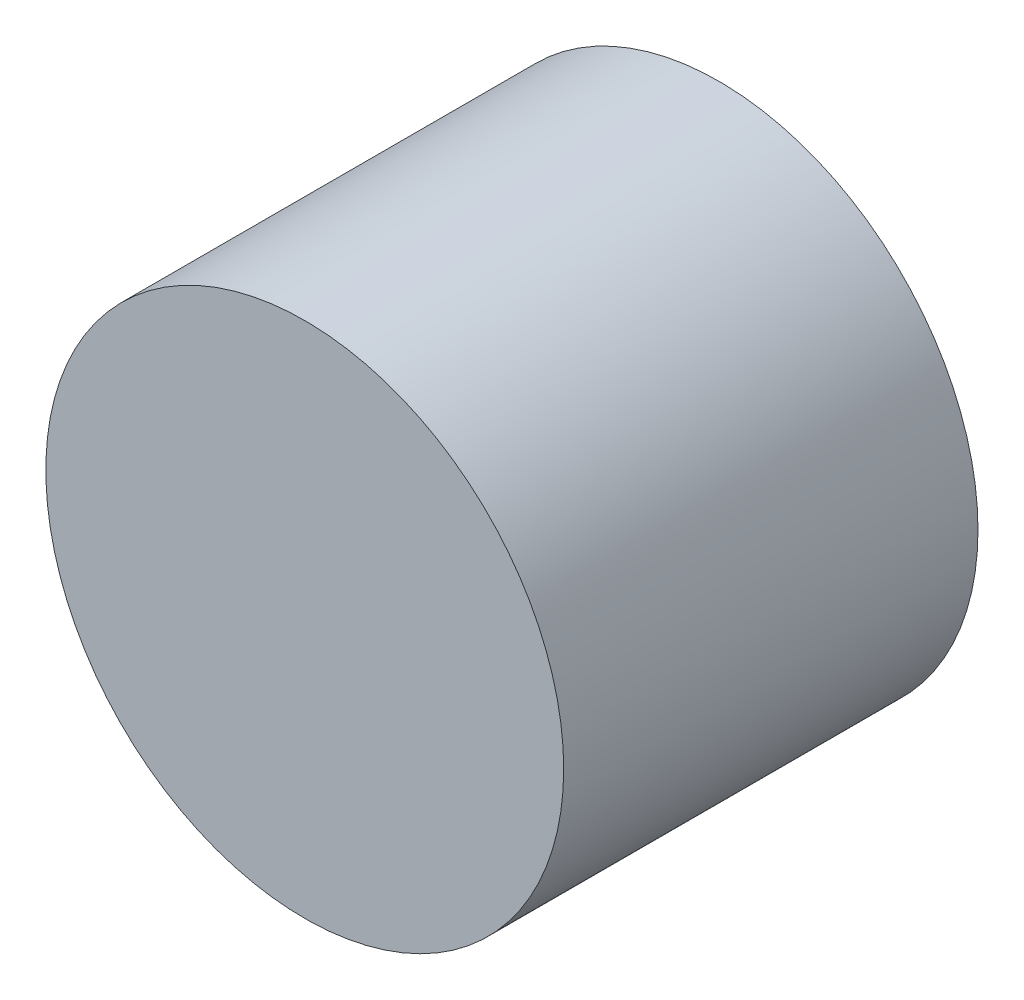
ISO-10303-21;
HEADER;
FILE_DESCRIPTION(('STEP AP214'),'2;1');
FILE_NAME('part.step','',(''),(''),'','','');
FILE_SCHEMA(('AUTOMOTIVE_DESIGN { 1 0 10303 214 1 1 1 1 }'));
ENDSEC;
DATA;
#1=APPLICATION_CONTEXT('core data for automotive mechanical design processes');
#2=APPLICATION_PROTOCOL_DEFINITION('international standard','automotive_design',2000,#1);
#3=PRODUCT_CONTEXT('',#1,'mechanical');
#4=PRODUCT('Part','Part','',(#3));
#5=PRODUCT_RELATED_PRODUCT_CATEGORY('part','',(#4));
#6=PRODUCT_DEFINITION_FORMATION('','',#4);
#7=PRODUCT_DEFINITION_CONTEXT('part definition',#1,'design');
#8=PRODUCT_DEFINITION('design','',#6,#7);
#9=PRODUCT_DEFINITION_SHAPE('','',#8);
#10=(LENGTH_UNIT() NAMED_UNIT(*) SI_UNIT(.MILLI.,.METRE.));
#11=(NAMED_UNIT(*) PLANE_ANGLE_UNIT() SI_UNIT($,.RADIAN.));
#12=(NAMED_UNIT(*) SI_UNIT($,.STERADIAN.) SOLID_ANGLE_UNIT());
#13=UNCERTAINTY_MEASURE_WITH_UNIT(LENGTH_MEASURE(1.E-05),#10,'distance_accuracy_value','');
#14=(GEOMETRIC_REPRESENTATION_CONTEXT(3) GLOBAL_UNCERTAINTY_ASSIGNED_CONTEXT((#13)) GLOBAL_UNIT_ASSIGNED_CONTEXT((#10,
#11,#12)) REPRESENTATION_CONTEXT('',''));
#15=CARTESIAN_POINT('',(0.,0.,0.));
#16=DIRECTION('',(0.,0.,1.));
#17=DIRECTION('',(1.,0.,0.));
#18=AXIS2_PLACEMENT_3D('',#15,#16,#17);
#19=CARTESIAN_POINT('',(0.,0.,1.));
#20=DIRECTION('',(0.,0.,-1.));
#21=DIRECTION('',(-1.,0.,0.));
#22=AXIS2_PLACEMENT_3D('',#19,#20,#21);
#23=CYLINDRICAL_SURFACE('',#22,1.5);
#24=CARTESIAN_POINT('',(0.,0.,0.9));
#25=DIRECTION('',(0.,0.,1.));
#26=DIRECTION('',(1.,0.,0.));
#27=AXIS2_PLACEMENT_3D('',#24,#25,#26);
#28=CIRCLE('',#27,1.5);
#29=CARTESIAN_POINT('',(1.5,0.,0.9));
#30=VERTEX_POINT('',#29);
#31=EDGE_CURVE('E44',#30,#30,#28,.T.);
#32=ORIENTED_EDGE('',*,*,#31,.T.);
#33=EDGE_LOOP('',(#32));
#34=FACE_BOUND('',#33,.T.);
#35=CARTESIAN_POINT('',(0.,0.,1.));
#36=DIRECTION('',(0.,0.,1.));
#37=DIRECTION('',(1.,0.,0.));
#38=AXIS2_PLACEMENT_3D('',#35,#36,#37);
#39=CIRCLE('',#38,1.5);
#40=CARTESIAN_POINT('',(1.5,0.,1.));
#41=VERTEX_POINT('',#40);
#42=EDGE_CURVE('E48',#41,#41,#39,.T.);
#43=ORIENTED_EDGE('',*,*,#42,.F.);
#44=EDGE_LOOP('',(#43));
#45=FACE_BOUND('',#44,.T.);
#46=ADVANCED_FACE('F37',(#34,#45),#23,.T.);
#47=CARTESIAN_POINT('',(0.,0.,0.));
#48=DIRECTION('',(0.,0.,1.));
#49=DIRECTION('',(1.,0.,0.));
#50=AXIS2_PLACEMENT_3D('',#47,#48,#49);
#51=PLANE('',#50);
#52=CARTESIAN_POINT('',(0.,0.,0.));
#53=DIRECTION('',(0.,0.,1.));
#54=DIRECTION('',(1.,0.,0.));
#55=AXIS2_PLACEMENT_3D('',#52,#53,#54);
#56=CIRCLE('',#55,0.6);
#57=CARTESIAN_POINT('',(0.6,0.,0.));
#58=VERTEX_POINT('',#57);
#59=EDGE_CURVE('E10',#58,#58,#56,.F.);
#60=ORIENTED_EDGE('',*,*,#59,.T.);
#61=EDGE_LOOP('',(#60));
#62=FACE_BOUND('',#61,.T.);
#63=ADVANCED_FACE('F66',(#62),#51,.F.);
#64=CARTESIAN_POINT('',(0.,0.,5.));
#65=DIRECTION('',(0.,0.,-1.));
#66=DIRECTION('',(-1.,0.,0.));
#67=AXIS2_PLACEMENT_3D('',#64,#65,#66);
#68=CYLINDRICAL_SURFACE('',#67,2.5);
#69=CARTESIAN_POINT('',(0.,0.,5.));
#70=DIRECTION('',(0.,0.,1.));
#71=DIRECTION('',(1.,0.,0.));
#72=AXIS2_PLACEMENT_3D('',#69,#70,#71);
#73=CIRCLE('',#72,2.5);
#74=CARTESIAN_POINT('',(2.5,0.,5.));
#75=VERTEX_POINT('',#74);
#76=EDGE_CURVE('E52',#75,#75,#73,.T.);
#77=ORIENTED_EDGE('',*,*,#76,.F.);
#78=EDGE_LOOP('',(#77));
#79=FACE_BOUND('',#78,.T.);
#80=CARTESIAN_POINT('',(0.,0.,1.));
#81=DIRECTION('',(0.,0.,1.));
#82=DIRECTION('',(1.,0.,0.));
#83=AXIS2_PLACEMENT_3D('',#80,#81,#82);
#84=CIRCLE('',#83,2.5);
#85=CARTESIAN_POINT('',(2.5,0.,1.));
#86=VERTEX_POINT('',#85);
#87=EDGE_CURVE('E55',#86,#86,#84,.T.);
#88=ORIENTED_EDGE('',*,*,#87,.T.);
#89=EDGE_LOOP('',(#88));
#90=FACE_BOUND('',#89,.T.);
#91=ADVANCED_FACE('F63',(#79,#90),#68,.T.);
#92=CARTESIAN_POINT('',(0.,0.,5.));
#93=DIRECTION('',(0.,0.,1.));
#94=DIRECTION('',(1.,0.,0.));
#95=AXIS2_PLACEMENT_3D('',#92,#93,#94);
#96=PLANE('',#95);
#97=ORIENTED_EDGE('',*,*,#76,.T.);
#98=EDGE_LOOP('',(#97));
#99=FACE_BOUND('',#98,.T.);
#100=ADVANCED_FACE('F61',(#99),#96,.T.);
#101=CARTESIAN_POINT('',(0.,0.,1.));
#102=DIRECTION('',(0.,0.,1.));
#103=DIRECTION('',(1.,0.,0.));
#104=AXIS2_PLACEMENT_3D('',#101,#102,#103);
#105=PLANE('',#104);
#106=ORIENTED_EDGE('',*,*,#42,.T.);
#107=EDGE_LOOP('',(#106));
#108=FACE_BOUND('',#107,.T.);
#109=ORIENTED_EDGE('',*,*,#87,.F.);
#110=EDGE_LOOP('',(#109));
#111=FACE_BOUND('',#110,.T.);
#112=ADVANCED_FACE('F70',(#108,#111),#105,.F.);
#113=CARTESIAN_POINT('',(0.,0.,0.9));
#114=DIRECTION('',(0.,0.,1.));
#115=DIRECTION('',(1.,0.,0.));
#116=AXIS2_PLACEMENT_3D('',#113,#114,#115);
#117=DEGENERATE_TOROIDAL_SURFACE('',#116,0.6,0.9,.T.);
#118=ORIENTED_EDGE('',*,*,#59,.F.);
#119=EDGE_LOOP('',(#118));
#120=FACE_BOUND('',#119,.T.);
#121=ORIENTED_EDGE('',*,*,#31,.F.);
#122=EDGE_LOOP('',(#121));
#123=FACE_BOUND('',#122,.T.);
#124=ADVANCED_FACE('F39',(#120,#123),#117,.T.);
#125=CLOSED_SHELL('',(#46,#63,#91,#100,#112,#124));
#126=MANIFOLD_SOLID_BREP('B2',#125);
#127=ADVANCED_BREP_SHAPE_REPRESENTATION('',(#18,#126),#14);
#128=SHAPE_DEFINITION_REPRESENTATION(#9,#127);
ENDSEC;
END-ISO-10303-21;
